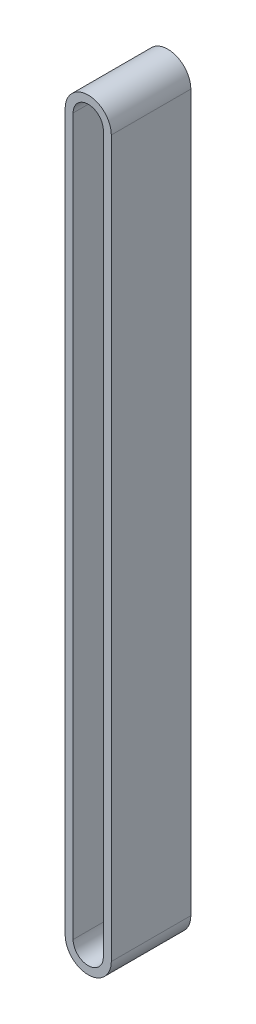
ISO-10303-21;
HEADER;
FILE_DESCRIPTION(('STEP AP214'),'2;1');
FILE_NAME('part.step','',(''),(''),'','','');
FILE_SCHEMA(('AUTOMOTIVE_DESIGN { 1 0 10303 214 1 1 1 1 }'));
ENDSEC;
DATA;
#1=APPLICATION_CONTEXT('core data for automotive mechanical design processes');
#2=APPLICATION_PROTOCOL_DEFINITION('international standard','automotive_design',2000,#1);
#3=PRODUCT_CONTEXT('',#1,'mechanical');
#4=PRODUCT('Part','Part','',(#3));
#5=PRODUCT_RELATED_PRODUCT_CATEGORY('part','',(#4));
#6=PRODUCT_DEFINITION_FORMATION('','',#4);
#7=PRODUCT_DEFINITION_CONTEXT('part definition',#1,'design');
#8=PRODUCT_DEFINITION('design','',#6,#7);
#9=PRODUCT_DEFINITION_SHAPE('','',#8);
#10=(LENGTH_UNIT() NAMED_UNIT(*) SI_UNIT(.MILLI.,.METRE.));
#11=(NAMED_UNIT(*) PLANE_ANGLE_UNIT() SI_UNIT($,.RADIAN.));
#12=(NAMED_UNIT(*) SI_UNIT($,.STERADIAN.) SOLID_ANGLE_UNIT());
#13=UNCERTAINTY_MEASURE_WITH_UNIT(LENGTH_MEASURE(1.E-05),#10,'distance_accuracy_value','');
#14=(GEOMETRIC_REPRESENTATION_CONTEXT(3) GLOBAL_UNCERTAINTY_ASSIGNED_CONTEXT((#13)) GLOBAL_UNIT_ASSIGNED_CONTEXT((#10,
#11,#12)) REPRESENTATION_CONTEXT('',''));
#15=CARTESIAN_POINT('',(0.,0.,0.));
#16=DIRECTION('',(0.,0.,1.));
#17=DIRECTION('',(1.,0.,0.));
#18=AXIS2_PLACEMENT_3D('',#15,#16,#17);
#19=CARTESIAN_POINT('',(-1.9,0.,10.));
#20=DIRECTION('',(0.,0.,-1.));
#21=DIRECTION('',(0.,-1.,0.));
#22=AXIS2_PLACEMENT_3D('',#19,#20,#21);
#23=PLANE('',#22);
#24=DIRECTION('',(0.,1.,0.));
#25=VECTOR('',#24,1.);
#26=CARTESIAN_POINT('',(-2.9,0.,10.));
#27=LINE('',#26,#25);
#28=CARTESIAN_POINT('',(-2.9,90.,10.));
#29=VERTEX_POINT('',#28);
#30=CARTESIAN_POINT('',(-2.9,0.,10.));
#31=VERTEX_POINT('',#30);
#32=EDGE_CURVE('E134',#29,#31,#27,.F.);
#33=ORIENTED_EDGE('',*,*,#32,.T.);
#34=CARTESIAN_POINT('',(0.,0.,10.));
#35=DIRECTION('',(0.,0.,1.));
#36=DIRECTION('',(1.,0.,0.));
#37=AXIS2_PLACEMENT_3D('',#34,#35,#36);
#38=CIRCLE('',#37,2.9);
#39=CARTESIAN_POINT('',(2.9,0.,10.));
#40=VERTEX_POINT('',#39);
#41=EDGE_CURVE('E56',#31,#40,#38,.T.);
#42=ORIENTED_EDGE('',*,*,#41,.T.);
#43=DIRECTION('',(0.,1.,0.));
#44=VECTOR('',#43,1.);
#45=CARTESIAN_POINT('',(2.9,0.,10.));
#46=LINE('',#45,#44);
#47=CARTESIAN_POINT('',(2.9,90.,10.));
#48=VERTEX_POINT('',#47);
#49=EDGE_CURVE('E163',#40,#48,#46,.T.);
#50=ORIENTED_EDGE('',*,*,#49,.T.);
#51=CARTESIAN_POINT('',(0.,90.,10.));
#52=DIRECTION('',(0.,0.,1.));
#53=DIRECTION('',(1.,0.,0.));
#54=AXIS2_PLACEMENT_3D('',#51,#52,#53);
#55=CIRCLE('',#54,2.9);
#56=EDGE_CURVE('E172',#48,#29,#55,.T.);
#57=ORIENTED_EDGE('',*,*,#56,.T.);
#58=EDGE_LOOP('',(#33,#42,#50,#57));
#59=FACE_BOUND('',#58,.T.);
#60=DIRECTION('',(0.,-1.,0.));
#61=VECTOR('',#60,1.);
#62=CARTESIAN_POINT('',(-1.9,0.,10.));
#63=LINE('',#62,#61);
#64=CARTESIAN_POINT('',(-1.9,90.,10.));
#65=VERTEX_POINT('',#64);
#66=CARTESIAN_POINT('',(-1.9,0.,10.));
#67=VERTEX_POINT('',#66);
#68=EDGE_CURVE('E120',#65,#67,#63,.T.);
#69=ORIENTED_EDGE('',*,*,#68,.F.);
#70=CARTESIAN_POINT('',(0.,90.,10.));
#71=DIRECTION('',(0.,0.,1.));
#72=DIRECTION('',(-1.,0.,0.));
#73=AXIS2_PLACEMENT_3D('',#70,#71,#72);
#74=CIRCLE('',#73,1.9);
#75=CARTESIAN_POINT('',(1.9,90.,10.));
#76=VERTEX_POINT('',#75);
#77=EDGE_CURVE('E116',#76,#65,#74,.T.);
#78=ORIENTED_EDGE('',*,*,#77,.F.);
#79=DIRECTION('',(0.,1.,0.));
#80=VECTOR('',#79,1.);
#81=CARTESIAN_POINT('',(1.9,0.,10.));
#82=LINE('',#81,#80);
#83=CARTESIAN_POINT('',(1.9,0.,10.));
#84=VERTEX_POINT('',#83);
#85=EDGE_CURVE('E128',#84,#76,#82,.T.);
#86=ORIENTED_EDGE('',*,*,#85,.F.);
#87=CARTESIAN_POINT('',(0.,0.,10.));
#88=DIRECTION('',(0.,0.,1.));
#89=DIRECTION('',(1.,0.,0.));
#90=AXIS2_PLACEMENT_3D('',#87,#88,#89);
#91=CIRCLE('',#90,1.9);
#92=EDGE_CURVE('E111',#67,#84,#91,.T.);
#93=ORIENTED_EDGE('',*,*,#92,.F.);
#94=EDGE_LOOP('',(#69,#78,#86,#93));
#95=FACE_BOUND('',#94,.T.);
#96=ADVANCED_FACE('F45',(#59,#95),#23,.F.);
#97=CARTESIAN_POINT('',(1.9,0.,0.));
#98=DIRECTION('',(0.,0.,-1.));
#99=DIRECTION('',(0.,1.,0.));
#100=AXIS2_PLACEMENT_3D('',#97,#98,#99);
#101=PLANE('',#100);
#102=DIRECTION('',(0.,1.,0.));
#103=VECTOR('',#102,1.);
#104=CARTESIAN_POINT('',(2.9,0.,0.));
#105=LINE('',#104,#103);
#106=CARTESIAN_POINT('',(2.9,0.,0.));
#107=VERTEX_POINT('',#106);
#108=CARTESIAN_POINT('',(2.9,90.,0.));
#109=VERTEX_POINT('',#108);
#110=EDGE_CURVE('E156',#107,#109,#105,.T.);
#111=ORIENTED_EDGE('',*,*,#110,.F.);
#112=CARTESIAN_POINT('',(0.,0.,0.));
#113=DIRECTION('',(0.,0.,1.));
#114=DIRECTION('',(1.,0.,0.));
#115=AXIS2_PLACEMENT_3D('',#112,#113,#114);
#116=CIRCLE('',#115,2.9);
#117=CARTESIAN_POINT('',(-2.9,0.,0.));
#118=VERTEX_POINT('',#117);
#119=EDGE_CURVE('E11',#118,#107,#116,.T.);
#120=ORIENTED_EDGE('',*,*,#119,.F.);
#121=DIRECTION('',(0.,1.,0.));
#122=VECTOR('',#121,1.);
#123=CARTESIAN_POINT('',(-2.9,0.,0.));
#124=LINE('',#123,#122);
#125=CARTESIAN_POINT('',(-2.9,90.,0.));
#126=VERTEX_POINT('',#125);
#127=EDGE_CURVE('E65',#126,#118,#124,.F.);
#128=ORIENTED_EDGE('',*,*,#127,.F.);
#129=CARTESIAN_POINT('',(0.,90.,0.));
#130=DIRECTION('',(0.,0.,1.));
#131=DIRECTION('',(1.,0.,0.));
#132=AXIS2_PLACEMENT_3D('',#129,#130,#131);
#133=CIRCLE('',#132,2.9);
#134=EDGE_CURVE('E160',#109,#126,#133,.T.);
#135=ORIENTED_EDGE('',*,*,#134,.F.);
#136=EDGE_LOOP('',(#111,#120,#128,#135));
#137=FACE_BOUND('',#136,.T.);
#138=DIRECTION('',(0.,1.,0.));
#139=VECTOR('',#138,1.);
#140=CARTESIAN_POINT('',(1.9,0.,0.));
#141=LINE('',#140,#139);
#142=CARTESIAN_POINT('',(1.9,0.,0.));
#143=VERTEX_POINT('',#142);
#144=CARTESIAN_POINT('',(1.9,90.,0.));
#145=VERTEX_POINT('',#144);
#146=EDGE_CURVE('E130',#143,#145,#141,.T.);
#147=ORIENTED_EDGE('',*,*,#146,.T.);
#148=CARTESIAN_POINT('',(0.,90.,0.));
#149=DIRECTION('',(0.,0.,1.));
#150=DIRECTION('',(-1.,0.,0.));
#151=AXIS2_PLACEMENT_3D('',#148,#149,#150);
#152=CIRCLE('',#151,1.9);
#153=CARTESIAN_POINT('',(-1.9,90.,0.));
#154=VERTEX_POINT('',#153);
#155=EDGE_CURVE('E146',#145,#154,#152,.T.);
#156=ORIENTED_EDGE('',*,*,#155,.T.);
#157=DIRECTION('',(0.,-1.,0.));
#158=VECTOR('',#157,1.);
#159=CARTESIAN_POINT('',(-1.9,0.,0.));
#160=LINE('',#159,#158);
#161=CARTESIAN_POINT('',(-1.9,0.,0.));
#162=VERTEX_POINT('',#161);
#163=EDGE_CURVE('E117',#154,#162,#160,.T.);
#164=ORIENTED_EDGE('',*,*,#163,.T.);
#165=CARTESIAN_POINT('',(0.,0.,0.));
#166=DIRECTION('',(0.,0.,1.));
#167=DIRECTION('',(1.,0.,0.));
#168=AXIS2_PLACEMENT_3D('',#165,#166,#167);
#169=CIRCLE('',#168,1.9);
#170=EDGE_CURVE('E113',#162,#143,#169,.T.);
#171=ORIENTED_EDGE('',*,*,#170,.T.);
#172=EDGE_LOOP('',(#147,#156,#164,#171));
#173=FACE_BOUND('',#172,.T.);
#174=ADVANCED_FACE('F47',(#137,#173),#101,.T.);
#175=CARTESIAN_POINT('',(0.,0.,0.));
#176=DIRECTION('',(0.,0.,1.));
#177=DIRECTION('',(1.,0.,0.));
#178=AXIS2_PLACEMENT_3D('',#175,#176,#177);
#179=CYLINDRICAL_SURFACE('',#178,2.9);
#180=ORIENTED_EDGE('',*,*,#41,.F.);
#181=DIRECTION('',(0.,0.,1.));
#182=VECTOR('',#181,1.);
#183=CARTESIAN_POINT('',(-2.9,0.,0.));
#184=LINE('',#183,#182);
#185=EDGE_CURVE('E166',#118,#31,#184,.T.);
#186=ORIENTED_EDGE('',*,*,#185,.F.);
#187=ORIENTED_EDGE('',*,*,#119,.T.);
#188=DIRECTION('',(0.,0.,1.));
#189=VECTOR('',#188,1.);
#190=CARTESIAN_POINT('',(2.9,0.,0.));
#191=LINE('',#190,#189);
#192=EDGE_CURVE('E159',#107,#40,#191,.T.);
#193=ORIENTED_EDGE('',*,*,#192,.T.);
#194=EDGE_LOOP('',(#180,#186,#187,#193));
#195=FACE_BOUND('',#194,.T.);
#196=ADVANCED_FACE('F198',(#195),#179,.T.);
#197=CARTESIAN_POINT('',(2.9,0.,0.));
#198=DIRECTION('',(1.,0.,0.));
#199=DIRECTION('',(0.,0.,-1.));
#200=AXIS2_PLACEMENT_3D('',#197,#198,#199);
#201=PLANE('',#200);
#202=ORIENTED_EDGE('',*,*,#49,.F.);
#203=ORIENTED_EDGE('',*,*,#192,.F.);
#204=ORIENTED_EDGE('',*,*,#110,.T.);
#205=DIRECTION('',(0.,0.,-1.));
#206=VECTOR('',#205,1.);
#207=CARTESIAN_POINT('',(2.9,90.,0.));
#208=LINE('',#207,#206);
#209=EDGE_CURVE('E164',#109,#48,#208,.F.);
#210=ORIENTED_EDGE('',*,*,#209,.T.);
#211=EDGE_LOOP('',(#202,#203,#204,#210));
#212=FACE_BOUND('',#211,.T.);
#213=ADVANCED_FACE('F212',(#212),#201,.T.);
#214=CARTESIAN_POINT('',(0.,90.,0.));
#215=DIRECTION('',(0.,0.,1.));
#216=DIRECTION('',(1.,0.,0.));
#217=AXIS2_PLACEMENT_3D('',#214,#215,#216);
#218=CYLINDRICAL_SURFACE('',#217,2.9);
#219=ORIENTED_EDGE('',*,*,#56,.F.);
#220=ORIENTED_EDGE('',*,*,#209,.F.);
#221=ORIENTED_EDGE('',*,*,#134,.T.);
#222=DIRECTION('',(0.,0.,1.));
#223=VECTOR('',#222,1.);
#224=CARTESIAN_POINT('',(-2.9,90.,0.));
#225=LINE('',#224,#223);
#226=EDGE_CURVE('E167',#126,#29,#225,.T.);
#227=ORIENTED_EDGE('',*,*,#226,.T.);
#228=EDGE_LOOP('',(#219,#220,#221,#227));
#229=FACE_BOUND('',#228,.T.);
#230=ADVANCED_FACE('F209',(#229),#218,.T.);
#231=CARTESIAN_POINT('',(-2.9,0.,0.));
#232=DIRECTION('',(-1.,0.,0.));
#233=DIRECTION('',(0.,0.,1.));
#234=AXIS2_PLACEMENT_3D('',#231,#232,#233);
#235=PLANE('',#234);
#236=ORIENTED_EDGE('',*,*,#32,.F.);
#237=ORIENTED_EDGE('',*,*,#226,.F.);
#238=ORIENTED_EDGE('',*,*,#127,.T.);
#239=ORIENTED_EDGE('',*,*,#185,.T.);
#240=EDGE_LOOP('',(#236,#237,#238,#239));
#241=FACE_BOUND('',#240,.T.);
#242=ADVANCED_FACE('F194',(#241),#235,.T.);
#243=CARTESIAN_POINT('',(0.,0.,0.));
#244=DIRECTION('',(0.,0.,1.));
#245=DIRECTION('',(1.,0.,0.));
#246=AXIS2_PLACEMENT_3D('',#243,#244,#245);
#247=CYLINDRICAL_SURFACE('',#246,1.9);
#248=ORIENTED_EDGE('',*,*,#92,.T.);
#249=DIRECTION('',(0.,0.,1.));
#250=VECTOR('',#249,1.);
#251=CARTESIAN_POINT('',(1.9,0.,0.));
#252=LINE('',#251,#250);
#253=EDGE_CURVE('E49',#143,#84,#252,.T.);
#254=ORIENTED_EDGE('',*,*,#253,.F.);
#255=ORIENTED_EDGE('',*,*,#170,.F.);
#256=DIRECTION('',(0.,0.,1.));
#257=VECTOR('',#256,1.);
#258=CARTESIAN_POINT('',(-1.9,0.,0.));
#259=LINE('',#258,#257);
#260=EDGE_CURVE('E108',#162,#67,#259,.T.);
#261=ORIENTED_EDGE('',*,*,#260,.T.);
#262=EDGE_LOOP('',(#248,#254,#255,#261));
#263=FACE_BOUND('',#262,.T.);
#264=ADVANCED_FACE('F109',(#263),#247,.F.);
#265=CARTESIAN_POINT('',(1.9,0.,0.));
#266=DIRECTION('',(1.,0.,0.));
#267=DIRECTION('',(0.,0.,-1.));
#268=AXIS2_PLACEMENT_3D('',#265,#266,#267);
#269=PLANE('',#268);
#270=ORIENTED_EDGE('',*,*,#85,.T.);
#271=DIRECTION('',(0.,0.,1.));
#272=VECTOR('',#271,1.);
#273=CARTESIAN_POINT('',(1.9,90.,0.));
#274=LINE('',#273,#272);
#275=EDGE_CURVE('E142',#145,#76,#274,.T.);
#276=ORIENTED_EDGE('',*,*,#275,.F.);
#277=ORIENTED_EDGE('',*,*,#146,.F.);
#278=ORIENTED_EDGE('',*,*,#253,.T.);
#279=EDGE_LOOP('',(#270,#276,#277,#278));
#280=FACE_BOUND('',#279,.T.);
#281=ADVANCED_FACE('F228',(#280),#269,.F.);
#282=CARTESIAN_POINT('',(0.,90.,0.));
#283=DIRECTION('',(0.,0.,1.));
#284=DIRECTION('',(1.,0.,0.));
#285=AXIS2_PLACEMENT_3D('',#282,#283,#284);
#286=CYLINDRICAL_SURFACE('',#285,1.9);
#287=ORIENTED_EDGE('',*,*,#77,.T.);
#288=DIRECTION('',(0.,0.,1.));
#289=VECTOR('',#288,1.);
#290=CARTESIAN_POINT('',(-1.9,90.,0.));
#291=LINE('',#290,#289);
#292=EDGE_CURVE('E102',#154,#65,#291,.T.);
#293=ORIENTED_EDGE('',*,*,#292,.F.);
#294=ORIENTED_EDGE('',*,*,#155,.F.);
#295=ORIENTED_EDGE('',*,*,#275,.T.);
#296=EDGE_LOOP('',(#287,#293,#294,#295));
#297=FACE_BOUND('',#296,.T.);
#298=ADVANCED_FACE('F231',(#297),#286,.F.);
#299=CARTESIAN_POINT('',(-1.9,0.,0.));
#300=DIRECTION('',(-1.,0.,0.));
#301=DIRECTION('',(0.,0.,1.));
#302=AXIS2_PLACEMENT_3D('',#299,#300,#301);
#303=PLANE('',#302);
#304=ORIENTED_EDGE('',*,*,#68,.T.);
#305=ORIENTED_EDGE('',*,*,#260,.F.);
#306=ORIENTED_EDGE('',*,*,#163,.F.);
#307=ORIENTED_EDGE('',*,*,#292,.T.);
#308=EDGE_LOOP('',(#304,#305,#306,#307));
#309=FACE_BOUND('',#308,.T.);
#310=ADVANCED_FACE('F121',(#309),#303,.F.);
#311=CLOSED_SHELL('',(#96,#174,#196,#213,#230,#242,#264,#281,#298,#310));
#312=MANIFOLD_SOLID_BREP('B2',#311);
#313=ADVANCED_BREP_SHAPE_REPRESENTATION('',(#18,#312),#14);
#314=SHAPE_DEFINITION_REPRESENTATION(#9,#313);
ENDSEC;
END-ISO-10303-21;
